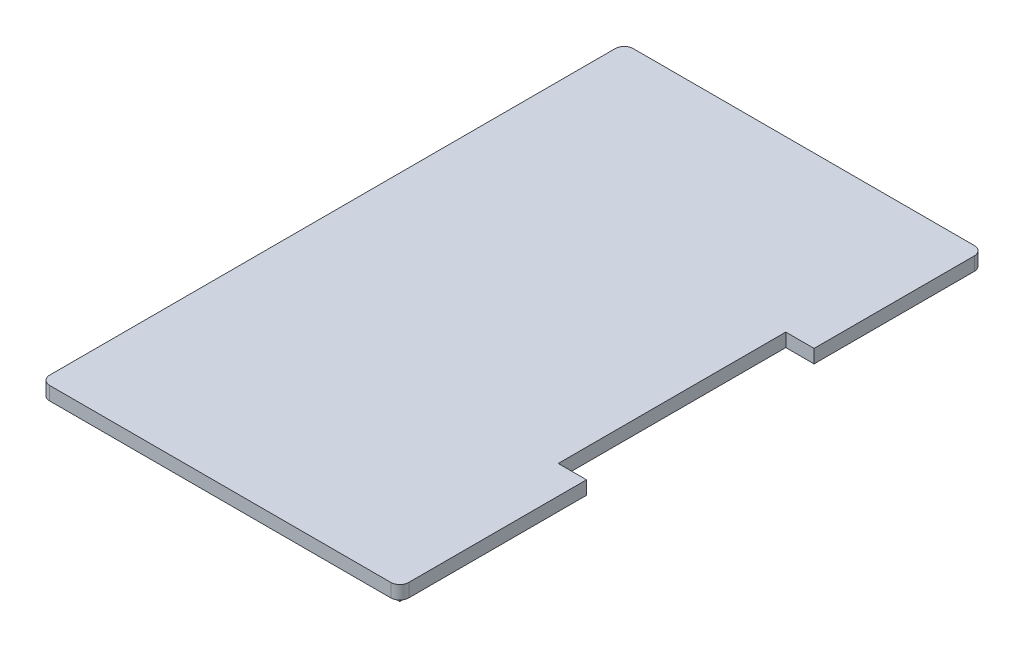
ISO-10303-21;
HEADER;
FILE_DESCRIPTION(('STEP AP214'),'2;1');
FILE_NAME('part.step','',(''),(''),'','','');
FILE_SCHEMA(('AUTOMOTIVE_DESIGN { 1 0 10303 214 1 1 1 1 }'));
ENDSEC;
DATA;
#1=APPLICATION_CONTEXT('core data for automotive mechanical design processes');
#2=APPLICATION_PROTOCOL_DEFINITION('international standard','automotive_design',2000,#1);
#3=PRODUCT_CONTEXT('',#1,'mechanical');
#4=PRODUCT('Part','Part','',(#3));
#5=PRODUCT_RELATED_PRODUCT_CATEGORY('part','',(#4));
#6=PRODUCT_DEFINITION_FORMATION('','',#4);
#7=PRODUCT_DEFINITION_CONTEXT('part definition',#1,'design');
#8=PRODUCT_DEFINITION('design','',#6,#7);
#9=PRODUCT_DEFINITION_SHAPE('','',#8);
#10=(LENGTH_UNIT() NAMED_UNIT(*) SI_UNIT(.MILLI.,.METRE.));
#11=(NAMED_UNIT(*) PLANE_ANGLE_UNIT() SI_UNIT($,.RADIAN.));
#12=(NAMED_UNIT(*) SI_UNIT($,.STERADIAN.) SOLID_ANGLE_UNIT());
#13=UNCERTAINTY_MEASURE_WITH_UNIT(LENGTH_MEASURE(1.E-05),#10,'distance_accuracy_value','');
#14=(GEOMETRIC_REPRESENTATION_CONTEXT(3) GLOBAL_UNCERTAINTY_ASSIGNED_CONTEXT((#13)) GLOBAL_UNIT_ASSIGNED_CONTEXT((#10,
#11,#12)) REPRESENTATION_CONTEXT('',''));
#15=CARTESIAN_POINT('',(0.,0.,0.));
#16=DIRECTION('',(0.,0.,1.));
#17=DIRECTION('',(1.,0.,0.));
#18=AXIS2_PLACEMENT_3D('',#15,#16,#17);
#19=CARTESIAN_POINT('',(0.,0.,0.));
#20=DIRECTION('',(0.,1.,0.));
#21=DIRECTION('',(0.,0.,1.));
#22=AXIS2_PLACEMENT_3D('',#19,#20,#21);
#23=PLANE('',#22);
#24=DIRECTION('',(1.,0.,0.));
#25=VECTOR('',#24,1.);
#26=CARTESIAN_POINT('',(0.,0.,-38.7218782862474));
#27=LINE('',#26,#25);
#28=CARTESIAN_POINT('',(-19.6177606177606,0.,-38.7218782862474));
#29=VERTEX_POINT('',#28);
#30=CARTESIAN_POINT('',(18.3822393822394,0.,-38.7218782862474));
#31=VERTEX_POINT('',#30);
#32=EDGE_CURVE('E458',#29,#31,#27,.T.);
#33=ORIENTED_EDGE('',*,*,#32,.T.);
#34=CARTESIAN_POINT('',(18.3822393822394,0.,-37.7218782862474));
#35=DIRECTION('',(0.,1.,0.));
#36=DIRECTION('',(0.,0.,1.));
#37=AXIS2_PLACEMENT_3D('',#34,#35,#36);
#38=CIRCLE('',#37,1.);
#39=CARTESIAN_POINT('',(19.3822393822394,0.,-37.7218782862474));
#40=VERTEX_POINT('',#39);
#41=EDGE_CURVE('E501',#31,#40,#38,.F.);
#42=ORIENTED_EDGE('',*,*,#41,.T.);
#43=DIRECTION('',(0.,0.,1.));
#44=VECTOR('',#43,1.);
#45=CARTESIAN_POINT('',(19.3822393822394,0.,0.));
#46=LINE('',#45,#44);
#47=CARTESIAN_POINT('',(19.3822393822394,0.,-19.8718782862474));
#48=VERTEX_POINT('',#47);
#49=EDGE_CURVE('E455',#40,#48,#46,.T.);
#50=ORIENTED_EDGE('',*,*,#49,.T.);
#51=DIRECTION('',(-1.,0.,0.));
#52=VECTOR('',#51,1.);
#53=CARTESIAN_POINT('',(0.,0.,-19.8718782862474));
#54=LINE('',#53,#52);
#55=CARTESIAN_POINT('',(16.2322393822394,0.,-19.8718782862474));
#56=VERTEX_POINT('',#55);
#57=EDGE_CURVE('E451',#48,#56,#54,.T.);
#58=ORIENTED_EDGE('',*,*,#57,.T.);
#59=DIRECTION('',(0.,0.,1.));
#60=VECTOR('',#59,1.);
#61=CARTESIAN_POINT('',(16.2322393822394,0.,0.));
#62=LINE('',#61,#60);
#63=CARTESIAN_POINT('',(16.2322393822394,0.,5.47812171375258));
#64=VERTEX_POINT('',#63);
#65=EDGE_CURVE('E419',#56,#64,#62,.T.);
#66=ORIENTED_EDGE('',*,*,#65,.T.);
#67=DIRECTION('',(-1.,0.,0.));
#68=VECTOR('',#67,1.);
#69=CARTESIAN_POINT('',(0.,0.,5.47812171375258));
#70=LINE('',#69,#68);
#71=CARTESIAN_POINT('',(19.3822393822394,0.,5.47812171375258));
#72=VERTEX_POINT('',#71);
#73=EDGE_CURVE('E425',#72,#64,#70,.T.);
#74=ORIENTED_EDGE('',*,*,#73,.F.);
#75=CARTESIAN_POINT('',(19.3822393822394,0.,25.2781217137526));
#76=VERTEX_POINT('',#75);
#77=EDGE_CURVE('E459',#72,#76,#46,.T.);
#78=ORIENTED_EDGE('',*,*,#77,.T.);
#79=CARTESIAN_POINT('',(18.3822393822394,0.,25.2781217137526));
#80=DIRECTION('',(0.,1.,0.));
#81=DIRECTION('',(0.,0.,1.));
#82=AXIS2_PLACEMENT_3D('',#79,#80,#81);
#83=CIRCLE('',#82,1.);
#84=CARTESIAN_POINT('',(18.3822393822394,0.,26.2781217137526));
#85=VERTEX_POINT('',#84);
#86=EDGE_CURVE('E492',#76,#85,#83,.F.);
#87=ORIENTED_EDGE('',*,*,#86,.T.);
#88=DIRECTION('',(1.,0.,0.));
#89=VECTOR('',#88,1.);
#90=CARTESIAN_POINT('',(0.,0.,26.2781217137526));
#91=LINE('',#90,#89);
#92=CARTESIAN_POINT('',(-19.6177606177606,0.,26.2781217137526));
#93=VERTEX_POINT('',#92);
#94=EDGE_CURVE('E467',#93,#85,#91,.T.);
#95=ORIENTED_EDGE('',*,*,#94,.F.);
#96=CARTESIAN_POINT('',(-19.6177606177606,0.,25.2781217137526));
#97=DIRECTION('',(0.,1.,0.));
#98=DIRECTION('',(0.,0.,1.));
#99=AXIS2_PLACEMENT_3D('',#96,#97,#98);
#100=CIRCLE('',#99,1.);
#101=CARTESIAN_POINT('',(-20.6177606177606,0.,25.2781217137526));
#102=VERTEX_POINT('',#101);
#103=EDGE_CURVE('E498',#93,#102,#100,.F.);
#104=ORIENTED_EDGE('',*,*,#103,.T.);
#105=DIRECTION('',(0.,0.,1.));
#106=VECTOR('',#105,1.);
#107=CARTESIAN_POINT('',(-20.6177606177606,0.,0.));
#108=LINE('',#107,#106);
#109=CARTESIAN_POINT('',(-20.6177606177606,0.,-37.7218782862474));
#110=VERTEX_POINT('',#109);
#111=EDGE_CURVE('E463',#110,#102,#108,.T.);
#112=ORIENTED_EDGE('',*,*,#111,.F.);
#113=CARTESIAN_POINT('',(-19.6177606177606,0.,-37.7218782862474));
#114=DIRECTION('',(0.,1.,0.));
#115=DIRECTION('',(0.,0.,1.));
#116=AXIS2_PLACEMENT_3D('',#113,#114,#115);
#117=CIRCLE('',#116,1.);
#118=EDGE_CURVE('E495',#110,#29,#117,.F.);
#119=ORIENTED_EDGE('',*,*,#118,.T.);
#120=EDGE_LOOP('',(#33,#42,#50,#58,#66,#74,#78,#87,#95,#104,#112,#119));
#121=FACE_BOUND('',#120,.T.);
#122=DIRECTION('',(0.,0.,-1.));
#123=VECTOR('',#122,1.);
#124=CARTESIAN_POINT('',(-18.9677606177606,0.,-37.0718782862474));
#125=LINE('',#124,#123);
#126=CARTESIAN_POINT('',(-18.9677606177606,0.,24.6281217137526));
#127=VERTEX_POINT('',#126);
#128=CARTESIAN_POINT('',(-18.9677606177606,0.,-37.0718782862474));
#129=VERTEX_POINT('',#128);
#130=EDGE_CURVE('E256',#127,#129,#125,.T.);
#131=ORIENTED_EDGE('',*,*,#130,.F.);
#132=DIRECTION('',(-1.,0.,0.));
#133=VECTOR('',#132,1.);
#134=CARTESIAN_POINT('',(-18.9677606177606,0.,24.6281217137526));
#135=LINE('',#134,#133);
#136=CARTESIAN_POINT('',(17.7322393822394,0.,24.6281217137526));
#137=VERTEX_POINT('',#136);
#138=EDGE_CURVE('E336',#137,#127,#135,.T.);
#139=ORIENTED_EDGE('',*,*,#138,.F.);
#140=DIRECTION('',(0.,0.,1.));
#141=VECTOR('',#140,1.);
#142=CARTESIAN_POINT('',(17.7322393822394,0.,24.6281217137526));
#143=LINE('',#142,#141);
#144=CARTESIAN_POINT('',(17.7322393822394,0.,7.12812171375258));
#145=VERTEX_POINT('',#144);
#146=EDGE_CURVE('E381',#145,#137,#143,.T.);
#147=ORIENTED_EDGE('',*,*,#146,.F.);
#148=DIRECTION('',(1.,0.,0.));
#149=VECTOR('',#148,1.);
#150=CARTESIAN_POINT('',(17.7322393822394,0.,7.12812171375258));
#151=LINE('',#150,#149);
#152=CARTESIAN_POINT('',(14.5822393822394,0.,7.12812171375258));
#153=VERTEX_POINT('',#152);
#154=EDGE_CURVE('E377',#153,#145,#151,.T.);
#155=ORIENTED_EDGE('',*,*,#154,.F.);
#156=DIRECTION('',(0.,0.,1.));
#157=VECTOR('',#156,1.);
#158=CARTESIAN_POINT('',(14.5822393822394,0.,7.12812171375258));
#159=LINE('',#158,#157);
#160=CARTESIAN_POINT('',(14.5822393822394,0.,-21.5218782862474));
#161=VERTEX_POINT('',#160);
#162=EDGE_CURVE('E373',#161,#153,#159,.T.);
#163=ORIENTED_EDGE('',*,*,#162,.F.);
#164=DIRECTION('',(-1.,0.,0.));
#165=VECTOR('',#164,1.);
#166=CARTESIAN_POINT('',(14.5822393822394,0.,-21.5218782862474));
#167=LINE('',#166,#165);
#168=CARTESIAN_POINT('',(17.7322393822394,0.,-21.5218782862474));
#169=VERTEX_POINT('',#168);
#170=EDGE_CURVE('E369',#169,#161,#167,.T.);
#171=ORIENTED_EDGE('',*,*,#170,.F.);
#172=DIRECTION('',(0.,0.,1.));
#173=VECTOR('',#172,1.);
#174=CARTESIAN_POINT('',(17.7322393822394,0.,-21.5218782862474));
#175=LINE('',#174,#173);
#176=CARTESIAN_POINT('',(17.7322393822394,0.,-37.0718782862474));
#177=VERTEX_POINT('',#176);
#178=EDGE_CURVE('E365',#177,#169,#175,.T.);
#179=ORIENTED_EDGE('',*,*,#178,.F.);
#180=DIRECTION('',(1.,0.,0.));
#181=VECTOR('',#180,1.);
#182=CARTESIAN_POINT('',(17.7322393822394,0.,-37.0718782862474));
#183=LINE('',#182,#181);
#184=EDGE_CURVE('E361',#129,#177,#183,.T.);
#185=ORIENTED_EDGE('',*,*,#184,.F.);
#186=EDGE_LOOP('',(#131,#139,#147,#155,#163,#171,#179,#185));
#187=FACE_BOUND('',#186,.T.);
#188=ADVANCED_FACE('F46',(#121,#187),#23,.F.);
#189=CARTESIAN_POINT('',(16.2322393822394,1.5,0.));
#190=DIRECTION('',(1.,0.,0.));
#191=DIRECTION('',(0.,0.,-1.));
#192=AXIS2_PLACEMENT_3D('',#189,#190,#191);
#193=PLANE('',#192);
#194=ORIENTED_EDGE('',*,*,#65,.F.);
#195=DIRECTION('',(0.,-1.,0.));
#196=VECTOR('',#195,1.);
#197=CARTESIAN_POINT('',(16.2322393822394,1.5,-19.8718782862474));
#198=LINE('',#197,#196);
#199=CARTESIAN_POINT('',(16.2322393822394,1.5,-19.8718782862474));
#200=VERTEX_POINT('',#199);
#201=EDGE_CURVE('E482',#200,#56,#198,.T.);
#202=ORIENTED_EDGE('',*,*,#201,.F.);
#203=DIRECTION('',(0.,0.,1.));
#204=VECTOR('',#203,1.);
#205=CARTESIAN_POINT('',(16.2322393822394,1.5,0.));
#206=LINE('',#205,#204);
#207=CARTESIAN_POINT('',(16.2322393822394,1.5,5.47812171375258));
#208=VERTEX_POINT('',#207);
#209=EDGE_CURVE('E420',#200,#208,#206,.T.);
#210=ORIENTED_EDGE('',*,*,#209,.T.);
#211=DIRECTION('',(0.,-1.,0.));
#212=VECTOR('',#211,1.);
#213=CARTESIAN_POINT('',(16.2322393822394,1.5,5.47812171375258));
#214=LINE('',#213,#212);
#215=EDGE_CURVE('E447',#208,#64,#214,.T.);
#216=ORIENTED_EDGE('',*,*,#215,.T.);
#217=EDGE_LOOP('',(#194,#202,#210,#216));
#218=FACE_BOUND('',#217,.T.);
#219=ADVANCED_FACE('F563',(#218),#193,.T.);
#220=CARTESIAN_POINT('',(0.,1.5,-19.8718782862474));
#221=DIRECTION('',(0.,0.,1.));
#222=DIRECTION('',(1.,0.,0.));
#223=AXIS2_PLACEMENT_3D('',#220,#221,#222);
#224=PLANE('',#223);
#225=ORIENTED_EDGE('',*,*,#57,.F.);
#226=DIRECTION('',(0.,-1.,0.));
#227=VECTOR('',#226,1.);
#228=CARTESIAN_POINT('',(19.3822393822394,1.5,-19.8718782862474));
#229=LINE('',#228,#227);
#230=CARTESIAN_POINT('',(19.3822393822394,1.5,-19.8718782862474));
#231=VERTEX_POINT('',#230);
#232=EDGE_CURVE('E478',#231,#48,#229,.T.);
#233=ORIENTED_EDGE('',*,*,#232,.F.);
#234=DIRECTION('',(-1.,0.,0.));
#235=VECTOR('',#234,1.);
#236=CARTESIAN_POINT('',(0.,1.5,-19.8718782862474));
#237=LINE('',#236,#235);
#238=EDGE_CURVE('E424',#231,#200,#237,.T.);
#239=ORIENTED_EDGE('',*,*,#238,.T.);
#240=ORIENTED_EDGE('',*,*,#201,.T.);
#241=EDGE_LOOP('',(#225,#233,#239,#240));
#242=FACE_BOUND('',#241,.T.);
#243=ADVANCED_FACE('F566',(#242),#224,.T.);
#244=CARTESIAN_POINT('',(19.3822393822394,1.5,0.));
#245=DIRECTION('',(1.,0.,0.));
#246=DIRECTION('',(0.,0.,-1.));
#247=AXIS2_PLACEMENT_3D('',#244,#245,#246);
#248=PLANE('',#247);
#249=ORIENTED_EDGE('',*,*,#49,.F.);
#250=DIRECTION('',(0.,-1.,0.));
#251=VECTOR('',#250,1.);
#252=CARTESIAN_POINT('',(19.3822393822394,1.5,-37.7218782862474));
#253=LINE('',#252,#251);
#254=CARTESIAN_POINT('',(19.3822393822394,1.5,-37.7218782862474));
#255=VERTEX_POINT('',#254);
#256=EDGE_CURVE('E504',#40,#255,#253,.F.);
#257=ORIENTED_EDGE('',*,*,#256,.T.);
#258=DIRECTION('',(0.,0.,1.));
#259=VECTOR('',#258,1.);
#260=CARTESIAN_POINT('',(19.3822393822394,1.5,0.));
#261=LINE('',#260,#259);
#262=EDGE_CURVE('E429',#255,#231,#261,.T.);
#263=ORIENTED_EDGE('',*,*,#262,.T.);
#264=ORIENTED_EDGE('',*,*,#232,.T.);
#265=EDGE_LOOP('',(#249,#257,#263,#264));
#266=FACE_BOUND('',#265,.T.);
#267=ADVANCED_FACE('F685',(#266),#248,.T.);
#268=CARTESIAN_POINT('',(0.,1.5,-38.7218782862474));
#269=DIRECTION('',(0.,0.,-1.));
#270=DIRECTION('',(-1.,0.,0.));
#271=AXIS2_PLACEMENT_3D('',#268,#269,#270);
#272=PLANE('',#271);
#273=DIRECTION('',(1.,0.,0.));
#274=VECTOR('',#273,1.);
#275=CARTESIAN_POINT('',(0.,1.5,-38.7218782862474));
#276=LINE('',#275,#274);
#277=CARTESIAN_POINT('',(-19.6177606177606,1.5,-38.7218782862474));
#278=VERTEX_POINT('',#277);
#279=CARTESIAN_POINT('',(18.3822393822394,1.5,-38.7218782862474));
#280=VERTEX_POINT('',#279);
#281=EDGE_CURVE('E432',#278,#280,#276,.T.);
#282=ORIENTED_EDGE('',*,*,#281,.T.);
#283=DIRECTION('',(0.,-1.,0.));
#284=VECTOR('',#283,1.);
#285=CARTESIAN_POINT('',(18.3822393822394,1.5,-38.7218782862474));
#286=LINE('',#285,#284);
#287=EDGE_CURVE('E488',#280,#31,#286,.T.);
#288=ORIENTED_EDGE('',*,*,#287,.T.);
#289=ORIENTED_EDGE('',*,*,#32,.F.);
#290=DIRECTION('',(0.,-1.,0.));
#291=VECTOR('',#290,1.);
#292=CARTESIAN_POINT('',(-19.6177606177606,1.5,-38.7218782862474));
#293=LINE('',#292,#291);
#294=EDGE_CURVE('E485',#29,#278,#293,.F.);
#295=ORIENTED_EDGE('',*,*,#294,.T.);
#296=EDGE_LOOP('',(#282,#288,#289,#295));
#297=FACE_BOUND('',#296,.T.);
#298=ADVANCED_FACE('F576',(#297),#272,.T.);
#299=CARTESIAN_POINT('',(-20.6177606177606,1.5,0.));
#300=DIRECTION('',(1.,0.,0.));
#301=DIRECTION('',(0.,0.,-1.));
#302=AXIS2_PLACEMENT_3D('',#299,#300,#301);
#303=PLANE('',#302);
#304=ORIENTED_EDGE('',*,*,#111,.T.);
#305=DIRECTION('',(0.,-1.,0.));
#306=VECTOR('',#305,1.);
#307=CARTESIAN_POINT('',(-20.6177606177606,1.5,25.2781217137526));
#308=LINE('',#307,#306);
#309=CARTESIAN_POINT('',(-20.6177606177606,1.5,25.2781217137526));
#310=VERTEX_POINT('',#309);
#311=EDGE_CURVE('E55',#102,#310,#308,.F.);
#312=ORIENTED_EDGE('',*,*,#311,.T.);
#313=DIRECTION('',(0.,0.,1.));
#314=VECTOR('',#313,1.);
#315=CARTESIAN_POINT('',(-20.6177606177606,1.5,0.));
#316=LINE('',#315,#314);
#317=CARTESIAN_POINT('',(-20.6177606177606,1.5,-37.7218782862474));
#318=VERTEX_POINT('',#317);
#319=EDGE_CURVE('E437',#318,#310,#316,.T.);
#320=ORIENTED_EDGE('',*,*,#319,.F.);
#321=DIRECTION('',(0.,-1.,0.));
#322=VECTOR('',#321,1.);
#323=CARTESIAN_POINT('',(-20.6177606177606,0.,-37.7218782862474));
#324=LINE('',#323,#322);
#325=EDGE_CURVE('E524',#318,#110,#324,.T.);
#326=ORIENTED_EDGE('',*,*,#325,.T.);
#327=EDGE_LOOP('',(#304,#312,#320,#326));
#328=FACE_BOUND('',#327,.T.);
#329=ADVANCED_FACE('F531',(#328),#303,.F.);
#330=CARTESIAN_POINT('',(0.,1.5,26.2781217137526));
#331=DIRECTION('',(0.,0.,-1.));
#332=DIRECTION('',(-1.,0.,0.));
#333=AXIS2_PLACEMENT_3D('',#330,#331,#332);
#334=PLANE('',#333);
#335=DIRECTION('',(1.,0.,0.));
#336=VECTOR('',#335,1.);
#337=CARTESIAN_POINT('',(0.,1.5,26.2781217137526));
#338=LINE('',#337,#336);
#339=CARTESIAN_POINT('',(-19.6177606177606,1.5,26.2781217137526));
#340=VERTEX_POINT('',#339);
#341=CARTESIAN_POINT('',(18.3822393822394,1.5,26.2781217137526));
#342=VERTEX_POINT('',#341);
#343=EDGE_CURVE('E441',#340,#342,#338,.T.);
#344=ORIENTED_EDGE('',*,*,#343,.F.);
#345=DIRECTION('',(0.,-1.,0.));
#346=VECTOR('',#345,1.);
#347=CARTESIAN_POINT('',(-19.6177606177606,1.5,26.2781217137526));
#348=LINE('',#347,#346);
#349=EDGE_CURVE('E520',#340,#93,#348,.T.);
#350=ORIENTED_EDGE('',*,*,#349,.T.);
#351=ORIENTED_EDGE('',*,*,#94,.T.);
#352=DIRECTION('',(0.,-1.,0.));
#353=VECTOR('',#352,1.);
#354=CARTESIAN_POINT('',(18.3822393822394,1.5,26.2781217137526));
#355=LINE('',#354,#353);
#356=EDGE_CURVE('E70',#85,#342,#355,.F.);
#357=ORIENTED_EDGE('',*,*,#356,.T.);
#358=EDGE_LOOP('',(#344,#350,#351,#357));
#359=FACE_BOUND('',#358,.T.);
#360=ADVANCED_FACE('F543',(#359),#334,.F.);
#361=CARTESIAN_POINT('',(19.3822393822394,1.5,5.47812171375258));
#362=VERTEX_POINT('',#361);
#363=CARTESIAN_POINT('',(19.3822393822394,1.5,25.2781217137526));
#364=VERTEX_POINT('',#363);
#365=EDGE_CURVE('E433',#362,#364,#261,.T.);
#366=ORIENTED_EDGE('',*,*,#365,.T.);
#367=DIRECTION('',(0.,-1.,0.));
#368=VECTOR('',#367,1.);
#369=CARTESIAN_POINT('',(19.3822393822394,0.,25.2781217137526));
#370=LINE('',#369,#368);
#371=EDGE_CURVE('E11',#364,#76,#370,.T.);
#372=ORIENTED_EDGE('',*,*,#371,.T.);
#373=ORIENTED_EDGE('',*,*,#77,.F.);
#374=DIRECTION('',(0.,-1.,0.));
#375=VECTOR('',#374,1.);
#376=CARTESIAN_POINT('',(19.3822393822394,1.5,5.47812171375258));
#377=LINE('',#376,#375);
#378=EDGE_CURVE('E475',#362,#72,#377,.T.);
#379=ORIENTED_EDGE('',*,*,#378,.F.);
#380=EDGE_LOOP('',(#366,#372,#373,#379));
#381=FACE_BOUND('',#380,.T.);
#382=ADVANCED_FACE('F552',(#381),#248,.T.);
#383=CARTESIAN_POINT('',(0.,1.5,5.47812171375258));
#384=DIRECTION('',(0.,0.,1.));
#385=DIRECTION('',(1.,0.,0.));
#386=AXIS2_PLACEMENT_3D('',#383,#384,#385);
#387=PLANE('',#386);
#388=ORIENTED_EDGE('',*,*,#73,.T.);
#389=ORIENTED_EDGE('',*,*,#215,.F.);
#390=DIRECTION('',(-1.,0.,0.));
#391=VECTOR('',#390,1.);
#392=CARTESIAN_POINT('',(0.,1.5,5.47812171375258));
#393=LINE('',#392,#391);
#394=EDGE_CURVE('E444',#362,#208,#393,.T.);
#395=ORIENTED_EDGE('',*,*,#394,.F.);
#396=ORIENTED_EDGE('',*,*,#378,.T.);
#397=EDGE_LOOP('',(#388,#389,#395,#396));
#398=FACE_BOUND('',#397,.T.);
#399=ADVANCED_FACE('F560',(#398),#387,.F.);
#400=CARTESIAN_POINT('',(0.,1.5,0.));
#401=DIRECTION('',(0.,1.,0.));
#402=DIRECTION('',(0.,0.,1.));
#403=AXIS2_PLACEMENT_3D('',#400,#401,#402);
#404=PLANE('',#403);
#405=ORIENTED_EDGE('',*,*,#262,.F.);
#406=CARTESIAN_POINT('',(18.3822393822394,1.5,-37.7218782862474));
#407=DIRECTION('',(0.,1.,0.));
#408=DIRECTION('',(0.,0.,1.));
#409=AXIS2_PLACEMENT_3D('',#406,#407,#408);
#410=CIRCLE('',#409,1.);
#411=EDGE_CURVE('E515',#255,#280,#410,.T.);
#412=ORIENTED_EDGE('',*,*,#411,.T.);
#413=ORIENTED_EDGE('',*,*,#281,.F.);
#414=CARTESIAN_POINT('',(-19.6177606177606,1.5,-37.7218782862474));
#415=DIRECTION('',(0.,1.,0.));
#416=DIRECTION('',(0.,0.,1.));
#417=AXIS2_PLACEMENT_3D('',#414,#415,#416);
#418=CIRCLE('',#417,1.);
#419=EDGE_CURVE('E509',#278,#318,#418,.T.);
#420=ORIENTED_EDGE('',*,*,#419,.T.);
#421=ORIENTED_EDGE('',*,*,#319,.T.);
#422=CARTESIAN_POINT('',(-19.6177606177606,1.5,25.2781217137526));
#423=DIRECTION('',(0.,1.,0.));
#424=DIRECTION('',(0.,0.,1.));
#425=AXIS2_PLACEMENT_3D('',#422,#423,#424);
#426=CIRCLE('',#425,1.);
#427=EDGE_CURVE('E512',#310,#340,#426,.T.);
#428=ORIENTED_EDGE('',*,*,#427,.T.);
#429=ORIENTED_EDGE('',*,*,#343,.T.);
#430=CARTESIAN_POINT('',(18.3822393822394,1.5,25.2781217137526));
#431=DIRECTION('',(0.,1.,0.));
#432=DIRECTION('',(0.,0.,1.));
#433=AXIS2_PLACEMENT_3D('',#430,#431,#432);
#434=CIRCLE('',#433,1.);
#435=EDGE_CURVE('E62',#342,#364,#434,.T.);
#436=ORIENTED_EDGE('',*,*,#435,.T.);
#437=ORIENTED_EDGE('',*,*,#365,.F.);
#438=ORIENTED_EDGE('',*,*,#394,.T.);
#439=ORIENTED_EDGE('',*,*,#209,.F.);
#440=ORIENTED_EDGE('',*,*,#238,.F.);
#441=EDGE_LOOP('',(#405,#412,#413,#420,#421,#428,#429,#436,#437,#438,#439,#440));
#442=FACE_BOUND('',#441,.T.);
#443=ADVANCED_FACE('F537',(#442),#404,.T.);
#444=CARTESIAN_POINT('',(0.,-1.5,0.));
#445=DIRECTION('',(0.,1.,0.));
#446=DIRECTION('',(0.,0.,1.));
#447=AXIS2_PLACEMENT_3D('',#444,#445,#446);
#448=PLANE('',#447);
#449=DIRECTION('',(0.,0.,-1.));
#450=VECTOR('',#449,1.);
#451=CARTESIAN_POINT('',(-18.9677606177606,-1.5,-37.0718782862474));
#452=LINE('',#451,#450);
#453=CARTESIAN_POINT('',(-18.9677606177606,-1.5,24.6281217137526));
#454=VERTEX_POINT('',#453);
#455=CARTESIAN_POINT('',(-18.9677606177606,-1.5,-37.0718782862474));
#456=VERTEX_POINT('',#455);
#457=EDGE_CURVE('E331',#454,#456,#452,.T.);
#458=ORIENTED_EDGE('',*,*,#457,.T.);
#459=DIRECTION('',(1.,0.,0.));
#460=VECTOR('',#459,1.);
#461=CARTESIAN_POINT('',(17.7322393822394,-1.5,-37.0718782862474));
#462=LINE('',#461,#460);
#463=CARTESIAN_POINT('',(17.7322393822394,-1.5,-37.0718782862474));
#464=VERTEX_POINT('',#463);
#465=EDGE_CURVE('E335',#456,#464,#462,.T.);
#466=ORIENTED_EDGE('',*,*,#465,.T.);
#467=DIRECTION('',(0.,0.,1.));
#468=VECTOR('',#467,1.);
#469=CARTESIAN_POINT('',(17.7322393822394,-1.5,-21.5218782862474));
#470=LINE('',#469,#468);
#471=CARTESIAN_POINT('',(17.7322393822394,-1.5,-21.5218782862474));
#472=VERTEX_POINT('',#471);
#473=EDGE_CURVE('E339',#464,#472,#470,.T.);
#474=ORIENTED_EDGE('',*,*,#473,.T.);
#475=DIRECTION('',(-1.,0.,0.));
#476=VECTOR('',#475,1.);
#477=CARTESIAN_POINT('',(14.5822393822394,-1.5,-21.5218782862474));
#478=LINE('',#477,#476);
#479=CARTESIAN_POINT('',(14.5822393822394,-1.5,-21.5218782862474));
#480=VERTEX_POINT('',#479);
#481=EDGE_CURVE('E342',#472,#480,#478,.T.);
#482=ORIENTED_EDGE('',*,*,#481,.T.);
#483=DIRECTION('',(0.,0.,1.));
#484=VECTOR('',#483,1.);
#485=CARTESIAN_POINT('',(14.5822393822394,-1.5,7.12812171375258));
#486=LINE('',#485,#484);
#487=CARTESIAN_POINT('',(14.5822393822394,-1.5,7.12812171375258));
#488=VERTEX_POINT('',#487);
#489=EDGE_CURVE('E345',#480,#488,#486,.T.);
#490=ORIENTED_EDGE('',*,*,#489,.T.);
#491=DIRECTION('',(1.,0.,0.));
#492=VECTOR('',#491,1.);
#493=CARTESIAN_POINT('',(17.7322393822394,-1.5,7.12812171375258));
#494=LINE('',#493,#492);
#495=CARTESIAN_POINT('',(17.7322393822394,-1.5,7.12812171375258));
#496=VERTEX_POINT('',#495);
#497=EDGE_CURVE('E348',#488,#496,#494,.T.);
#498=ORIENTED_EDGE('',*,*,#497,.T.);
#499=DIRECTION('',(0.,0.,1.));
#500=VECTOR('',#499,1.);
#501=CARTESIAN_POINT('',(17.7322393822394,-1.5,24.6281217137526));
#502=LINE('',#501,#500);
#503=CARTESIAN_POINT('',(17.7322393822394,-1.5,24.6281217137526));
#504=VERTEX_POINT('',#503);
#505=EDGE_CURVE('E351',#496,#504,#502,.T.);
#506=ORIENTED_EDGE('',*,*,#505,.T.);
#507=DIRECTION('',(-1.,0.,0.));
#508=VECTOR('',#507,1.);
#509=CARTESIAN_POINT('',(-18.9677606177606,-1.5,24.6281217137526));
#510=LINE('',#509,#508);
#511=EDGE_CURVE('E354',#504,#454,#510,.T.);
#512=ORIENTED_EDGE('',*,*,#511,.T.);
#513=EDGE_LOOP('',(#458,#466,#474,#482,#490,#498,#506,#512));
#514=FACE_BOUND('',#513,.T.);
#515=DIRECTION('',(-1.,0.,0.));
#516=VECTOR('',#515,1.);
#517=CARTESIAN_POINT('',(16.2322393822394,-1.5,23.1281217137526));
#518=LINE('',#517,#516);
#519=CARTESIAN_POINT('',(16.2322393822394,-1.5,23.1281217137526));
#520=VERTEX_POINT('',#519);
#521=CARTESIAN_POINT('',(-17.4677606177606,-1.5,23.1281217137526));
#522=VERTEX_POINT('',#521);
#523=EDGE_CURVE('E236',#520,#522,#518,.T.);
#524=ORIENTED_EDGE('',*,*,#523,.F.);
#525=DIRECTION('',(0.,0.,1.));
#526=VECTOR('',#525,1.);
#527=CARTESIAN_POINT('',(16.2322393822394,-1.5,8.62812171375258));
#528=LINE('',#527,#526);
#529=CARTESIAN_POINT('',(16.2322393822394,-1.5,8.62812171375258));
#530=VERTEX_POINT('',#529);
#531=EDGE_CURVE('E281',#530,#520,#528,.T.);
#532=ORIENTED_EDGE('',*,*,#531,.F.);
#533=DIRECTION('',(1.,0.,0.));
#534=VECTOR('',#533,1.);
#535=CARTESIAN_POINT('',(13.0822393822394,-1.5,8.62812171375258));
#536=LINE('',#535,#534);
#537=CARTESIAN_POINT('',(13.0822393822394,-1.5,8.62812171375258));
#538=VERTEX_POINT('',#537);
#539=EDGE_CURVE('E277',#538,#530,#536,.T.);
#540=ORIENTED_EDGE('',*,*,#539,.F.);
#541=DIRECTION('',(0.,0.,1.));
#542=VECTOR('',#541,1.);
#543=CARTESIAN_POINT('',(13.0822393822394,-1.5,-23.0218782862474));
#544=LINE('',#543,#542);
#545=CARTESIAN_POINT('',(13.0822393822394,-1.5,-23.0218782862474));
#546=VERTEX_POINT('',#545);
#547=EDGE_CURVE('E274',#546,#538,#544,.T.);
#548=ORIENTED_EDGE('',*,*,#547,.F.);
#549=DIRECTION('',(-1.,0.,0.));
#550=VECTOR('',#549,1.);
#551=CARTESIAN_POINT('',(16.2322393822394,-1.5,-23.0218782862474));
#552=LINE('',#551,#550);
#553=CARTESIAN_POINT('',(16.2322393822394,-1.5,-23.0218782862474));
#554=VERTEX_POINT('',#553);
#555=EDGE_CURVE('E271',#554,#546,#552,.T.);
#556=ORIENTED_EDGE('',*,*,#555,.F.);
#557=DIRECTION('',(0.,0.,1.));
#558=VECTOR('',#557,1.);
#559=CARTESIAN_POINT('',(16.2322393822394,-1.5,-35.5718782862474));
#560=LINE('',#559,#558);
#561=CARTESIAN_POINT('',(16.2322393822394,-1.5,-35.5718782862474));
#562=VERTEX_POINT('',#561);
#563=EDGE_CURVE('E266',#562,#554,#560,.T.);
#564=ORIENTED_EDGE('',*,*,#563,.F.);
#565=DIRECTION('',(1.,0.,0.));
#566=VECTOR('',#565,1.);
#567=CARTESIAN_POINT('',(-17.4677606177606,-1.5,-35.5718782862474));
#568=LINE('',#567,#566);
#569=CARTESIAN_POINT('',(-17.4677606177606,-1.5,-35.5718782862474));
#570=VERTEX_POINT('',#569);
#571=EDGE_CURVE('E262',#570,#562,#568,.T.);
#572=ORIENTED_EDGE('',*,*,#571,.F.);
#573=DIRECTION('',(0.,0.,-1.));
#574=VECTOR('',#573,1.);
#575=CARTESIAN_POINT('',(-17.4677606177606,-1.5,23.1281217137526));
#576=LINE('',#575,#574);
#577=EDGE_CURVE('E247',#522,#570,#576,.T.);
#578=ORIENTED_EDGE('',*,*,#577,.F.);
#579=EDGE_LOOP('',(#524,#532,#540,#548,#556,#564,#572,#578));
#580=FACE_BOUND('',#579,.T.);
#581=ADVANCED_FACE('F260',(#514,#580),#448,.F.);
#582=CARTESIAN_POINT('',(-18.9677606177606,-1.5,-37.0718782862474));
#583=DIRECTION('',(1.,0.,0.));
#584=DIRECTION('',(0.,0.,-1.));
#585=AXIS2_PLACEMENT_3D('',#582,#583,#584);
#586=PLANE('',#585);
#587=ORIENTED_EDGE('',*,*,#130,.T.);
#588=DIRECTION('',(0.,1.,0.));
#589=VECTOR('',#588,1.);
#590=CARTESIAN_POINT('',(-18.9677606177606,-1.5,-37.0718782862474));
#591=LINE('',#590,#589);
#592=EDGE_CURVE('E415',#456,#129,#591,.T.);
#593=ORIENTED_EDGE('',*,*,#592,.F.);
#594=ORIENTED_EDGE('',*,*,#457,.F.);
#595=DIRECTION('',(0.,1.,0.));
#596=VECTOR('',#595,1.);
#597=CARTESIAN_POINT('',(-18.9677606177606,-1.5,24.6281217137526));
#598=LINE('',#597,#596);
#599=EDGE_CURVE('E357',#454,#127,#598,.T.);
#600=ORIENTED_EDGE('',*,*,#599,.T.);
#601=EDGE_LOOP('',(#587,#593,#594,#600));
#602=FACE_BOUND('',#601,.T.);
#603=ADVANCED_FACE('F645',(#602),#586,.F.);
#604=CARTESIAN_POINT('',(17.7322393822394,-1.5,-37.0718782862474));
#605=DIRECTION('',(0.,0.,1.));
#606=DIRECTION('',(1.,0.,0.));
#607=AXIS2_PLACEMENT_3D('',#604,#605,#606);
#608=PLANE('',#607);
#609=ORIENTED_EDGE('',*,*,#184,.T.);
#610=DIRECTION('',(0.,1.,0.));
#611=VECTOR('',#610,1.);
#612=CARTESIAN_POINT('',(17.7322393822394,-1.5,-37.0718782862474));
#613=LINE('',#612,#611);
#614=EDGE_CURVE('E411',#464,#177,#613,.T.);
#615=ORIENTED_EDGE('',*,*,#614,.F.);
#616=ORIENTED_EDGE('',*,*,#465,.F.);
#617=ORIENTED_EDGE('',*,*,#592,.T.);
#618=EDGE_LOOP('',(#609,#615,#616,#617));
#619=FACE_BOUND('',#618,.T.);
#620=ADVANCED_FACE('F669',(#619),#608,.F.);
#621=CARTESIAN_POINT('',(17.7322393822394,-1.5,-21.5218782862474));
#622=DIRECTION('',(-1.,0.,0.));
#623=DIRECTION('',(0.,0.,1.));
#624=AXIS2_PLACEMENT_3D('',#621,#622,#623);
#625=PLANE('',#624);
#626=ORIENTED_EDGE('',*,*,#178,.T.);
#627=DIRECTION('',(0.,1.,0.));
#628=VECTOR('',#627,1.);
#629=CARTESIAN_POINT('',(17.7322393822394,-1.5,-21.5218782862474));
#630=LINE('',#629,#628);
#631=EDGE_CURVE('E407',#472,#169,#630,.T.);
#632=ORIENTED_EDGE('',*,*,#631,.F.);
#633=ORIENTED_EDGE('',*,*,#473,.F.);
#634=ORIENTED_EDGE('',*,*,#614,.T.);
#635=EDGE_LOOP('',(#626,#632,#633,#634));
#636=FACE_BOUND('',#635,.T.);
#637=ADVANCED_FACE('F665',(#636),#625,.F.);
#638=CARTESIAN_POINT('',(14.5822393822394,-1.5,-21.5218782862474));
#639=DIRECTION('',(0.,0.,-1.));
#640=DIRECTION('',(-1.,0.,0.));
#641=AXIS2_PLACEMENT_3D('',#638,#639,#640);
#642=PLANE('',#641);
#643=ORIENTED_EDGE('',*,*,#170,.T.);
#644=DIRECTION('',(0.,1.,0.));
#645=VECTOR('',#644,1.);
#646=CARTESIAN_POINT('',(14.5822393822394,-1.5,-21.5218782862474));
#647=LINE('',#646,#645);
#648=EDGE_CURVE('E403',#480,#161,#647,.T.);
#649=ORIENTED_EDGE('',*,*,#648,.F.);
#650=ORIENTED_EDGE('',*,*,#481,.F.);
#651=ORIENTED_EDGE('',*,*,#631,.T.);
#652=EDGE_LOOP('',(#643,#649,#650,#651));
#653=FACE_BOUND('',#652,.T.);
#654=ADVANCED_FACE('F661',(#653),#642,.F.);
#655=CARTESIAN_POINT('',(14.5822393822394,-1.5,7.12812171375258));
#656=DIRECTION('',(-1.,0.,0.));
#657=DIRECTION('',(0.,0.,1.));
#658=AXIS2_PLACEMENT_3D('',#655,#656,#657);
#659=PLANE('',#658);
#660=ORIENTED_EDGE('',*,*,#162,.T.);
#661=DIRECTION('',(0.,1.,0.));
#662=VECTOR('',#661,1.);
#663=CARTESIAN_POINT('',(14.5822393822394,-1.5,7.12812171375258));
#664=LINE('',#663,#662);
#665=EDGE_CURVE('E399',#488,#153,#664,.T.);
#666=ORIENTED_EDGE('',*,*,#665,.F.);
#667=ORIENTED_EDGE('',*,*,#489,.F.);
#668=ORIENTED_EDGE('',*,*,#648,.T.);
#669=EDGE_LOOP('',(#660,#666,#667,#668));
#670=FACE_BOUND('',#669,.T.);
#671=ADVANCED_FACE('F657',(#670),#659,.F.);
#672=CARTESIAN_POINT('',(17.7322393822394,-1.5,7.12812171375258));
#673=DIRECTION('',(0.,0.,1.));
#674=DIRECTION('',(1.,0.,0.));
#675=AXIS2_PLACEMENT_3D('',#672,#673,#674);
#676=PLANE('',#675);
#677=ORIENTED_EDGE('',*,*,#154,.T.);
#678=DIRECTION('',(0.,1.,0.));
#679=VECTOR('',#678,1.);
#680=CARTESIAN_POINT('',(17.7322393822394,-1.5,7.12812171375258));
#681=LINE('',#680,#679);
#682=EDGE_CURVE('E395',#496,#145,#681,.T.);
#683=ORIENTED_EDGE('',*,*,#682,.F.);
#684=ORIENTED_EDGE('',*,*,#497,.F.);
#685=ORIENTED_EDGE('',*,*,#665,.T.);
#686=EDGE_LOOP('',(#677,#683,#684,#685));
#687=FACE_BOUND('',#686,.T.);
#688=ADVANCED_FACE('F653',(#687),#676,.F.);
#689=CARTESIAN_POINT('',(17.7322393822394,-1.5,24.6281217137526));
#690=DIRECTION('',(-1.,0.,0.));
#691=DIRECTION('',(0.,0.,1.));
#692=AXIS2_PLACEMENT_3D('',#689,#690,#691);
#693=PLANE('',#692);
#694=ORIENTED_EDGE('',*,*,#146,.T.);
#695=DIRECTION('',(0.,1.,0.));
#696=VECTOR('',#695,1.);
#697=CARTESIAN_POINT('',(17.7322393822394,-1.5,24.6281217137526));
#698=LINE('',#697,#696);
#699=EDGE_CURVE('E391',#504,#137,#698,.T.);
#700=ORIENTED_EDGE('',*,*,#699,.F.);
#701=ORIENTED_EDGE('',*,*,#505,.F.);
#702=ORIENTED_EDGE('',*,*,#682,.T.);
#703=EDGE_LOOP('',(#694,#700,#701,#702));
#704=FACE_BOUND('',#703,.T.);
#705=ADVANCED_FACE('F649',(#704),#693,.F.);
#706=CARTESIAN_POINT('',(-18.9677606177606,-1.5,24.6281217137526));
#707=DIRECTION('',(0.,0.,-1.));
#708=DIRECTION('',(-1.,0.,0.));
#709=AXIS2_PLACEMENT_3D('',#706,#707,#708);
#710=PLANE('',#709);
#711=ORIENTED_EDGE('',*,*,#138,.T.);
#712=ORIENTED_EDGE('',*,*,#599,.F.);
#713=ORIENTED_EDGE('',*,*,#511,.F.);
#714=ORIENTED_EDGE('',*,*,#699,.T.);
#715=EDGE_LOOP('',(#711,#712,#713,#714));
#716=FACE_BOUND('',#715,.T.);
#717=ADVANCED_FACE('F642',(#716),#710,.F.);
#718=CARTESIAN_POINT('',(16.2322393822394,-1.5,23.1281217137526));
#719=DIRECTION('',(0.,0.,-1.));
#720=DIRECTION('',(-1.,0.,0.));
#721=AXIS2_PLACEMENT_3D('',#718,#719,#720);
#722=PLANE('',#721);
#723=DIRECTION('',(-1.,0.,0.));
#724=VECTOR('',#723,1.);
#725=CARTESIAN_POINT('',(16.2322393822394,0.,23.1281217137526));
#726=LINE('',#725,#724);
#727=CARTESIAN_POINT('',(16.2322393822394,0.,23.1281217137526));
#728=VERTEX_POINT('',#727);
#729=CARTESIAN_POINT('',(-17.4677606177606,0.,23.1281217137526));
#730=VERTEX_POINT('',#729);
#731=EDGE_CURVE('E284',#728,#730,#726,.T.);
#732=ORIENTED_EDGE('',*,*,#731,.F.);
#733=DIRECTION('',(0.,1.,0.));
#734=VECTOR('',#733,1.);
#735=CARTESIAN_POINT('',(16.2322393822394,-1.5,23.1281217137526));
#736=LINE('',#735,#734);
#737=EDGE_CURVE('E242',#520,#728,#736,.T.);
#738=ORIENTED_EDGE('',*,*,#737,.F.);
#739=ORIENTED_EDGE('',*,*,#523,.T.);
#740=DIRECTION('',(0.,1.,0.));
#741=VECTOR('',#740,1.);
#742=CARTESIAN_POINT('',(-17.4677606177606,-1.5,23.1281217137526));
#743=LINE('',#742,#741);
#744=EDGE_CURVE('E240',#522,#730,#743,.T.);
#745=ORIENTED_EDGE('',*,*,#744,.T.);
#746=EDGE_LOOP('',(#732,#738,#739,#745));
#747=FACE_BOUND('',#746,.T.);
#748=ADVANCED_FACE('F239',(#747),#722,.T.);
#749=CARTESIAN_POINT('',(-17.4677606177606,-1.5,23.1281217137526));
#750=DIRECTION('',(1.,0.,0.));
#751=DIRECTION('',(0.,0.,-1.));
#752=AXIS2_PLACEMENT_3D('',#749,#750,#751);
#753=PLANE('',#752);
#754=DIRECTION('',(0.,0.,-1.));
#755=VECTOR('',#754,1.);
#756=CARTESIAN_POINT('',(-17.4677606177606,0.,23.1281217137526));
#757=LINE('',#756,#755);
#758=CARTESIAN_POINT('',(-17.4677606177606,0.,-35.5718782862474));
#759=VERTEX_POINT('',#758);
#760=EDGE_CURVE('E254',#730,#759,#757,.T.);
#761=ORIENTED_EDGE('',*,*,#760,.F.);
#762=ORIENTED_EDGE('',*,*,#744,.F.);
#763=ORIENTED_EDGE('',*,*,#577,.T.);
#764=DIRECTION('',(0.,1.,0.));
#765=VECTOR('',#764,1.);
#766=CARTESIAN_POINT('',(-17.4677606177606,-1.5,-35.5718782862474));
#767=LINE('',#766,#765);
#768=EDGE_CURVE('E257',#570,#759,#767,.T.);
#769=ORIENTED_EDGE('',*,*,#768,.T.);
#770=EDGE_LOOP('',(#761,#762,#763,#769));
#771=FACE_BOUND('',#770,.T.);
#772=ADVANCED_FACE('F251',(#771),#753,.T.);
#773=CARTESIAN_POINT('',(-17.4677606177606,-1.5,-35.5718782862474));
#774=DIRECTION('',(0.,0.,1.));
#775=DIRECTION('',(1.,0.,0.));
#776=AXIS2_PLACEMENT_3D('',#773,#774,#775);
#777=PLANE('',#776);
#778=DIRECTION('',(1.,0.,0.));
#779=VECTOR('',#778,1.);
#780=CARTESIAN_POINT('',(-17.4677606177606,0.,-35.5718782862474));
#781=LINE('',#780,#779);
#782=CARTESIAN_POINT('',(16.2322393822394,0.,-35.5718782862474));
#783=VERTEX_POINT('',#782);
#784=EDGE_CURVE('E289',#759,#783,#781,.T.);
#785=ORIENTED_EDGE('',*,*,#784,.F.);
#786=ORIENTED_EDGE('',*,*,#768,.F.);
#787=ORIENTED_EDGE('',*,*,#571,.T.);
#788=DIRECTION('',(0.,1.,0.));
#789=VECTOR('',#788,1.);
#790=CARTESIAN_POINT('',(16.2322393822394,-1.5,-35.5718782862474));
#791=LINE('',#790,#789);
#792=EDGE_CURVE('E326',#562,#783,#791,.T.);
#793=ORIENTED_EDGE('',*,*,#792,.T.);
#794=EDGE_LOOP('',(#785,#786,#787,#793));
#795=FACE_BOUND('',#794,.T.);
#796=ADVANCED_FACE('F629',(#795),#777,.T.);
#797=CARTESIAN_POINT('',(16.2322393822394,-1.5,-35.5718782862474));
#798=DIRECTION('',(-1.,0.,0.));
#799=DIRECTION('',(0.,0.,1.));
#800=AXIS2_PLACEMENT_3D('',#797,#798,#799);
#801=PLANE('',#800);
#802=DIRECTION('',(0.,0.,1.));
#803=VECTOR('',#802,1.);
#804=CARTESIAN_POINT('',(16.2322393822394,0.,-35.5718782862474));
#805=LINE('',#804,#803);
#806=CARTESIAN_POINT('',(16.2322393822394,0.,-23.0218782862474));
#807=VERTEX_POINT('',#806);
#808=EDGE_CURVE('E293',#783,#807,#805,.T.);
#809=ORIENTED_EDGE('',*,*,#808,.F.);
#810=ORIENTED_EDGE('',*,*,#792,.F.);
#811=ORIENTED_EDGE('',*,*,#563,.T.);
#812=DIRECTION('',(0.,1.,0.));
#813=VECTOR('',#812,1.);
#814=CARTESIAN_POINT('',(16.2322393822394,-1.5,-23.0218782862474));
#815=LINE('',#814,#813);
#816=EDGE_CURVE('E323',#554,#807,#815,.T.);
#817=ORIENTED_EDGE('',*,*,#816,.T.);
#818=EDGE_LOOP('',(#809,#810,#811,#817));
#819=FACE_BOUND('',#818,.T.);
#820=ADVANCED_FACE('F626',(#819),#801,.T.);
#821=CARTESIAN_POINT('',(16.2322393822394,-1.5,-23.0218782862474));
#822=DIRECTION('',(0.,0.,-1.));
#823=DIRECTION('',(-1.,0.,0.));
#824=AXIS2_PLACEMENT_3D('',#821,#822,#823);
#825=PLANE('',#824);
#826=DIRECTION('',(-1.,0.,0.));
#827=VECTOR('',#826,1.);
#828=CARTESIAN_POINT('',(16.2322393822394,0.,-23.0218782862474));
#829=LINE('',#828,#827);
#830=CARTESIAN_POINT('',(13.0822393822394,0.,-23.0218782862474));
#831=VERTEX_POINT('',#830);
#832=EDGE_CURVE('E297',#807,#831,#829,.T.);
#833=ORIENTED_EDGE('',*,*,#832,.F.);
#834=ORIENTED_EDGE('',*,*,#816,.F.);
#835=ORIENTED_EDGE('',*,*,#555,.T.);
#836=DIRECTION('',(0.,1.,0.));
#837=VECTOR('',#836,1.);
#838=CARTESIAN_POINT('',(13.0822393822394,-1.5,-23.0218782862474));
#839=LINE('',#838,#837);
#840=EDGE_CURVE('E320',#546,#831,#839,.T.);
#841=ORIENTED_EDGE('',*,*,#840,.T.);
#842=EDGE_LOOP('',(#833,#834,#835,#841));
#843=FACE_BOUND('',#842,.T.);
#844=ADVANCED_FACE('F621',(#843),#825,.T.);
#845=CARTESIAN_POINT('',(13.0822393822394,-1.5,-23.0218782862474));
#846=DIRECTION('',(-1.,0.,0.));
#847=DIRECTION('',(0.,0.,1.));
#848=AXIS2_PLACEMENT_3D('',#845,#846,#847);
#849=PLANE('',#848);
#850=DIRECTION('',(0.,0.,1.));
#851=VECTOR('',#850,1.);
#852=CARTESIAN_POINT('',(13.0822393822394,0.,-23.0218782862474));
#853=LINE('',#852,#851);
#854=CARTESIAN_POINT('',(13.0822393822394,0.,8.62812171375258));
#855=VERTEX_POINT('',#854);
#856=EDGE_CURVE('E301',#831,#855,#853,.T.);
#857=ORIENTED_EDGE('',*,*,#856,.F.);
#858=ORIENTED_EDGE('',*,*,#840,.F.);
#859=ORIENTED_EDGE('',*,*,#547,.T.);
#860=DIRECTION('',(0.,1.,0.));
#861=VECTOR('',#860,1.);
#862=CARTESIAN_POINT('',(13.0822393822394,-1.5,8.62812171375258));
#863=LINE('',#862,#861);
#864=EDGE_CURVE('E317',#538,#855,#863,.T.);
#865=ORIENTED_EDGE('',*,*,#864,.T.);
#866=EDGE_LOOP('',(#857,#858,#859,#865));
#867=FACE_BOUND('',#866,.T.);
#868=ADVANCED_FACE('F617',(#867),#849,.T.);
#869=CARTESIAN_POINT('',(13.0822393822394,-1.5,8.62812171375258));
#870=DIRECTION('',(0.,0.,1.));
#871=DIRECTION('',(1.,0.,0.));
#872=AXIS2_PLACEMENT_3D('',#869,#870,#871);
#873=PLANE('',#872);
#874=DIRECTION('',(1.,0.,0.));
#875=VECTOR('',#874,1.);
#876=CARTESIAN_POINT('',(13.0822393822394,0.,8.62812171375258));
#877=LINE('',#876,#875);
#878=CARTESIAN_POINT('',(16.2322393822394,0.,8.62812171375258));
#879=VERTEX_POINT('',#878);
#880=EDGE_CURVE('E305',#855,#879,#877,.T.);
#881=ORIENTED_EDGE('',*,*,#880,.F.);
#882=ORIENTED_EDGE('',*,*,#864,.F.);
#883=ORIENTED_EDGE('',*,*,#539,.T.);
#884=DIRECTION('',(0.,1.,0.));
#885=VECTOR('',#884,1.);
#886=CARTESIAN_POINT('',(16.2322393822394,-1.5,8.62812171375258));
#887=LINE('',#886,#885);
#888=EDGE_CURVE('E314',#530,#879,#887,.T.);
#889=ORIENTED_EDGE('',*,*,#888,.T.);
#890=EDGE_LOOP('',(#881,#882,#883,#889));
#891=FACE_BOUND('',#890,.T.);
#892=ADVANCED_FACE('F605',(#891),#873,.T.);
#893=CARTESIAN_POINT('',(16.2322393822394,-1.5,8.62812171375258));
#894=DIRECTION('',(-1.,0.,0.));
#895=DIRECTION('',(0.,0.,1.));
#896=AXIS2_PLACEMENT_3D('',#893,#894,#895);
#897=PLANE('',#896);
#898=DIRECTION('',(0.,0.,1.));
#899=VECTOR('',#898,1.);
#900=CARTESIAN_POINT('',(16.2322393822394,0.,8.62812171375258));
#901=LINE('',#900,#899);
#902=EDGE_CURVE('E248',#879,#728,#901,.T.);
#903=ORIENTED_EDGE('',*,*,#902,.F.);
#904=ORIENTED_EDGE('',*,*,#888,.F.);
#905=ORIENTED_EDGE('',*,*,#531,.T.);
#906=ORIENTED_EDGE('',*,*,#737,.T.);
#907=EDGE_LOOP('',(#903,#904,#905,#906));
#908=FACE_BOUND('',#907,.T.);
#909=ADVANCED_FACE('F598',(#908),#897,.T.);
#910=ORIENTED_EDGE('',*,*,#902,.T.);
#911=ORIENTED_EDGE('',*,*,#731,.T.);
#912=ORIENTED_EDGE('',*,*,#760,.T.);
#913=ORIENTED_EDGE('',*,*,#784,.T.);
#914=ORIENTED_EDGE('',*,*,#808,.T.);
#915=ORIENTED_EDGE('',*,*,#832,.T.);
#916=ORIENTED_EDGE('',*,*,#856,.T.);
#917=ORIENTED_EDGE('',*,*,#880,.T.);
#918=EDGE_LOOP('',(#910,#911,#912,#913,#914,#915,#916,#917));
#919=FACE_BOUND('',#918,.T.);
#920=ADVANCED_FACE('F589',(#919),#23,.F.);
#921=CARTESIAN_POINT('',(18.3822393822394,1.5,-37.7218782862474));
#922=DIRECTION('',(0.,-1.,0.));
#923=DIRECTION('',(0.,0.,-1.));
#924=AXIS2_PLACEMENT_3D('',#921,#922,#923);
#925=CYLINDRICAL_SURFACE('',#924,1.);
#926=ORIENTED_EDGE('',*,*,#411,.F.);
#927=ORIENTED_EDGE('',*,*,#256,.F.);
#928=ORIENTED_EDGE('',*,*,#41,.F.);
#929=ORIENTED_EDGE('',*,*,#287,.F.);
#930=EDGE_LOOP('',(#926,#927,#928,#929));
#931=FACE_BOUND('',#930,.T.);
#932=ADVANCED_FACE('F573',(#931),#925,.T.);
#933=CARTESIAN_POINT('',(-19.6177606177606,1.5,25.2781217137526));
#934=DIRECTION('',(0.,-1.,0.));
#935=DIRECTION('',(0.,0.,-1.));
#936=AXIS2_PLACEMENT_3D('',#933,#934,#935);
#937=CYLINDRICAL_SURFACE('',#936,1.);
#938=ORIENTED_EDGE('',*,*,#427,.F.);
#939=ORIENTED_EDGE('',*,*,#311,.F.);
#940=ORIENTED_EDGE('',*,*,#103,.F.);
#941=ORIENTED_EDGE('',*,*,#349,.F.);
#942=EDGE_LOOP('',(#938,#939,#940,#941));
#943=FACE_BOUND('',#942,.T.);
#944=ADVANCED_FACE('F541',(#943),#937,.T.);
#945=CARTESIAN_POINT('',(-19.6177606177606,1.5,-37.7218782862474));
#946=DIRECTION('',(0.,1.,0.));
#947=DIRECTION('',(0.,0.,1.));
#948=AXIS2_PLACEMENT_3D('',#945,#946,#947);
#949=CYLINDRICAL_SURFACE('',#948,1.);
#950=ORIENTED_EDGE('',*,*,#419,.F.);
#951=ORIENTED_EDGE('',*,*,#294,.F.);
#952=ORIENTED_EDGE('',*,*,#118,.F.);
#953=ORIENTED_EDGE('',*,*,#325,.F.);
#954=EDGE_LOOP('',(#950,#951,#952,#953));
#955=FACE_BOUND('',#954,.T.);
#956=ADVANCED_FACE('F580',(#955),#949,.T.);
#957=CARTESIAN_POINT('',(18.3822393822394,1.5,25.2781217137526));
#958=DIRECTION('',(0.,1.,0.));
#959=DIRECTION('',(0.,0.,1.));
#960=AXIS2_PLACEMENT_3D('',#957,#958,#959);
#961=CYLINDRICAL_SURFACE('',#960,1.);
#962=ORIENTED_EDGE('',*,*,#435,.F.);
#963=ORIENTED_EDGE('',*,*,#356,.F.);
#964=ORIENTED_EDGE('',*,*,#86,.F.);
#965=ORIENTED_EDGE('',*,*,#371,.F.);
#966=EDGE_LOOP('',(#962,#963,#964,#965));
#967=FACE_BOUND('',#966,.T.);
#968=ADVANCED_FACE('F48',(#967),#961,.T.);
#969=CLOSED_SHELL('',(#188,#219,#243,#267,#298,#329,#360,#382,#399,#443,#581,#603,#620,#637,
#654,#671,#688,#705,#717,#748,#772,#796,#820,#844,#868,#892,#909,#920,#932,#944,#956,#968));
#970=MANIFOLD_SOLID_BREP('B2',#969);
#971=ADVANCED_BREP_SHAPE_REPRESENTATION('',(#18,#970),#14);
#972=SHAPE_DEFINITION_REPRESENTATION(#9,#971);
ENDSEC;
END-ISO-10303-21;
